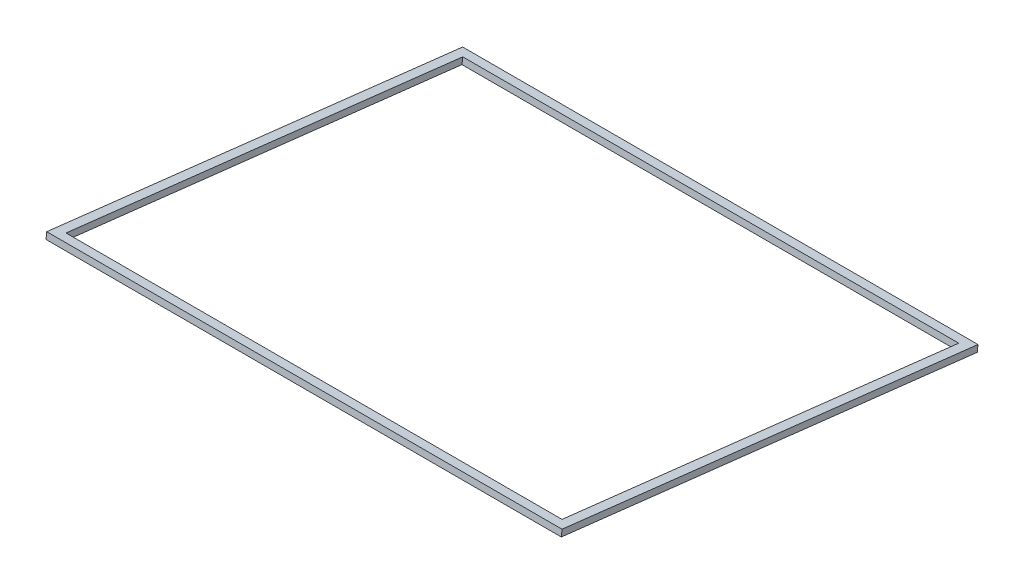
ISO-10303-21;
HEADER;
FILE_DESCRIPTION(('STEP AP214'),'2;1');
FILE_NAME('part.step','',(''),(''),'','','');
FILE_SCHEMA(('AUTOMOTIVE_DESIGN { 1 0 10303 214 1 1 1 1 }'));
ENDSEC;
DATA;
#1=APPLICATION_CONTEXT('core data for automotive mechanical design processes');
#2=APPLICATION_PROTOCOL_DEFINITION('international standard','automotive_design',2000,#1);
#3=PRODUCT_CONTEXT('',#1,'mechanical');
#4=PRODUCT('Part','Part','',(#3));
#5=PRODUCT_RELATED_PRODUCT_CATEGORY('part','',(#4));
#6=PRODUCT_DEFINITION_FORMATION('','',#4);
#7=PRODUCT_DEFINITION_CONTEXT('part definition',#1,'design');
#8=PRODUCT_DEFINITION('design','',#6,#7);
#9=PRODUCT_DEFINITION_SHAPE('','',#8);
#10=(LENGTH_UNIT() NAMED_UNIT(*) SI_UNIT(.MILLI.,.METRE.));
#11=(NAMED_UNIT(*) PLANE_ANGLE_UNIT() SI_UNIT($,.RADIAN.));
#12=(NAMED_UNIT(*) SI_UNIT($,.STERADIAN.) SOLID_ANGLE_UNIT());
#13=UNCERTAINTY_MEASURE_WITH_UNIT(LENGTH_MEASURE(1.E-05),#10,'distance_accuracy_value','');
#14=(GEOMETRIC_REPRESENTATION_CONTEXT(3) GLOBAL_UNCERTAINTY_ASSIGNED_CONTEXT((#13)) GLOBAL_UNIT_ASSIGNED_CONTEXT((#10,
#11,#12)) REPRESENTATION_CONTEXT('',''));
#15=CARTESIAN_POINT('',(0.,0.,0.));
#16=DIRECTION('',(0.,0.,1.));
#17=DIRECTION('',(1.,0.,0.));
#18=AXIS2_PLACEMENT_3D('',#15,#16,#17);
#19=CARTESIAN_POINT('',(-214.99999999998,449.434853441623,-268.547807359262));
#20=DIRECTION('',(-1.,0.,0.));
#21=DIRECTION('',(0.,-1.,0.));
#22=AXIS2_PLACEMENT_3D('',#19,#20,#21);
#23=PLANE('',#22);
#24=DIRECTION('',(0.,0.114660273656609,0.993404762241953));
#25=VECTOR('',#24,1.);
#26=CARTESIAN_POINT('',(-214.99999999998,451.421662966107,-268.777127906575));
#27=LINE('',#26,#25);
#28=CARTESIAN_POINT('',(-214.99999999998,451.421662966107,-268.777127906575));
#29=VERTEX_POINT('',#28);
#30=CARTESIAN_POINT('',(-214.99999999998,466.327498541466,-139.634508815121));
#31=VERTEX_POINT('',#30);
#32=EDGE_CURVE('E135',#29,#31,#27,.T.);
#33=ORIENTED_EDGE('',*,*,#32,.F.);
#34=DIRECTION('',(0.,0.993404762241953,-0.114660273656608));
#35=VECTOR('',#34,1.);
#36=CARTESIAN_POINT('',(-214.99999999998,449.434853441623,-268.547807359262));
#37=LINE('',#36,#35);
#38=CARTESIAN_POINT('',(-214.99999999998,449.434853441623,-268.547807359262));
#39=VERTEX_POINT('',#38);
#40=EDGE_CURVE('E11',#39,#29,#37,.T.);
#41=ORIENTED_EDGE('',*,*,#40,.F.);
#42=DIRECTION('',(0.,0.114660273656609,0.993404762241953));
#43=VECTOR('',#42,1.);
#44=CARTESIAN_POINT('',(-214.99999999998,449.434853441623,-268.547807359262));
#45=LINE('',#44,#43);
#46=CARTESIAN_POINT('',(-214.99999999998,464.340689016982,-139.405188267808));
#47=VERTEX_POINT('',#46);
#48=EDGE_CURVE('E139',#39,#47,#45,.T.);
#49=ORIENTED_EDGE('',*,*,#48,.T.);
#50=DIRECTION('',(0.,0.993404762241953,-0.114660273656608));
#51=VECTOR('',#50,1.);
#52=CARTESIAN_POINT('',(-214.99999999998,464.340689016982,-139.405188267808));
#53=LINE('',#52,#51);
#54=EDGE_CURVE('E40',#47,#31,#53,.T.);
#55=ORIENTED_EDGE('',*,*,#54,.T.);
#56=EDGE_LOOP('',(#33,#41,#49,#55));
#57=FACE_BOUND('',#56,.T.);
#58=ADVANCED_FACE('F37',(#57),#23,.T.);
#59=CARTESIAN_POINT('',(-54.9999999999791,449.434853441624,-268.547807359262));
#60=DIRECTION('',(0.,-0.114660273656608,-0.993404762241953));
#61=DIRECTION('',(0.,0.993404762241953,-0.114660273656608));
#62=AXIS2_PLACEMENT_3D('',#59,#60,#61);
#63=PLANE('',#62);
#64=DIRECTION('',(-1.,0.,0.));
#65=VECTOR('',#64,1.);
#66=CARTESIAN_POINT('',(-54.9999999999791,451.421662966108,-268.777127906575));
#67=LINE('',#66,#65);
#68=CARTESIAN_POINT('',(-54.9999999999791,451.421662966108,-268.777127906575));
#69=VERTEX_POINT('',#68);
#70=EDGE_CURVE('E143',#69,#29,#67,.T.);
#71=ORIENTED_EDGE('',*,*,#70,.F.);
#72=DIRECTION('',(0.,0.993404762241953,-0.114660273656608));
#73=VECTOR('',#72,1.);
#74=CARTESIAN_POINT('',(-54.9999999999791,449.434853441624,-268.547807359262));
#75=LINE('',#74,#73);
#76=CARTESIAN_POINT('',(-54.9999999999791,449.434853441624,-268.547807359262));
#77=VERTEX_POINT('',#76);
#78=EDGE_CURVE('E45',#77,#69,#75,.T.);
#79=ORIENTED_EDGE('',*,*,#78,.F.);
#80=DIRECTION('',(-1.,0.,0.));
#81=VECTOR('',#80,1.);
#82=CARTESIAN_POINT('',(-54.9999999999791,449.434853441624,-268.547807359262));
#83=LINE('',#82,#81);
#84=EDGE_CURVE('E149',#77,#39,#83,.T.);
#85=ORIENTED_EDGE('',*,*,#84,.T.);
#86=ORIENTED_EDGE('',*,*,#40,.T.);
#87=EDGE_LOOP('',(#71,#79,#85,#86));
#88=FACE_BOUND('',#87,.T.);
#89=ADVANCED_FACE('F175',(#88),#63,.T.);
#90=CARTESIAN_POINT('',(-54.9999999999791,464.340689016984,-139.405188267808));
#91=DIRECTION('',(1.,0.,0.));
#92=DIRECTION('',(0.,1.,0.));
#93=AXIS2_PLACEMENT_3D('',#90,#91,#92);
#94=PLANE('',#93);
#95=DIRECTION('',(0.,-0.114660273656608,-0.993404762241953));
#96=VECTOR('',#95,1.);
#97=CARTESIAN_POINT('',(-54.9999999999791,466.327498541467,-139.634508815121));
#98=LINE('',#97,#96);
#99=CARTESIAN_POINT('',(-54.9999999999791,466.327498541467,-139.634508815121));
#100=VERTEX_POINT('',#99);
#101=EDGE_CURVE('E157',#100,#69,#98,.T.);
#102=ORIENTED_EDGE('',*,*,#101,.F.);
#103=DIRECTION('',(0.,0.993404762241953,-0.114660273656608));
#104=VECTOR('',#103,1.);
#105=CARTESIAN_POINT('',(-54.9999999999791,464.340689016984,-139.405188267808));
#106=LINE('',#105,#104);
#107=CARTESIAN_POINT('',(-54.9999999999791,464.340689016984,-139.405188267808));
#108=VERTEX_POINT('',#107);
#109=EDGE_CURVE('E162',#108,#100,#106,.T.);
#110=ORIENTED_EDGE('',*,*,#109,.F.);
#111=DIRECTION('',(0.,-0.114660273656608,-0.993404762241953));
#112=VECTOR('',#111,1.);
#113=CARTESIAN_POINT('',(-54.9999999999791,464.340689016984,-139.405188267808));
#114=LINE('',#113,#112);
#115=EDGE_CURVE('E146',#108,#77,#114,.T.);
#116=ORIENTED_EDGE('',*,*,#115,.T.);
#117=ORIENTED_EDGE('',*,*,#78,.T.);
#118=EDGE_LOOP('',(#102,#110,#116,#117));
#119=FACE_BOUND('',#118,.T.);
#120=ADVANCED_FACE('F179',(#119),#94,.T.);
#121=CARTESIAN_POINT('',(-214.99999999998,464.340689016982,-139.405188267808));
#122=DIRECTION('',(0.,0.114660273656608,0.993404762241953));
#123=DIRECTION('',(0.,-0.993404762241953,0.114660273656608));
#124=AXIS2_PLACEMENT_3D('',#121,#122,#123);
#125=PLANE('',#124);
#126=DIRECTION('',(1.,0.,0.));
#127=VECTOR('',#126,1.);
#128=CARTESIAN_POINT('',(-214.99999999998,466.327498541466,-139.634508815121));
#129=LINE('',#128,#127);
#130=EDGE_CURVE('E154',#31,#100,#129,.T.);
#131=ORIENTED_EDGE('',*,*,#130,.F.);
#132=ORIENTED_EDGE('',*,*,#54,.F.);
#133=DIRECTION('',(1.,0.,0.));
#134=VECTOR('',#133,1.);
#135=CARTESIAN_POINT('',(-214.99999999998,464.340689016982,-139.405188267808));
#136=LINE('',#135,#134);
#137=EDGE_CURVE('E142',#47,#108,#136,.T.);
#138=ORIENTED_EDGE('',*,*,#137,.T.);
#139=ORIENTED_EDGE('',*,*,#109,.T.);
#140=EDGE_LOOP('',(#131,#132,#138,#139));
#141=FACE_BOUND('',#140,.T.);
#142=ADVANCED_FACE('F170',(#141),#125,.T.);
#143=CARTESIAN_POINT('',(-3.19288301413542E-12,474.114829221433,-54.7230475727731));
#144=DIRECTION('',(0.,0.993404762241953,-0.114660273656609));
#145=DIRECTION('',(0.,0.114660273656609,0.993404762241953));
#146=AXIS2_PLACEMENT_3D('',#143,#144,#145);
#147=PLANE('',#146);
#148=DIRECTION('',(-1.,0.,0.));
#149=VECTOR('',#148,1.);
#150=CARTESIAN_POINT('',(-57.9999999999791,449.778834262594,-265.567593072536));
#151=LINE('',#150,#149);
#152=CARTESIAN_POINT('',(-57.9999999999791,449.778834262594,-265.567593072536));
#153=VERTEX_POINT('',#152);
#154=CARTESIAN_POINT('',(-211.99999999998,449.778834262593,-265.567593072536));
#155=VERTEX_POINT('',#154);
#156=EDGE_CURVE('E110',#153,#155,#151,.T.);
#157=ORIENTED_EDGE('',*,*,#156,.T.);
#158=DIRECTION('',(0.,0.114660273656608,0.993404762241953));
#159=VECTOR('',#158,1.);
#160=CARTESIAN_POINT('',(-211.99999999998,449.778834262593,-265.567593072536));
#161=LINE('',#160,#159);
#162=CARTESIAN_POINT('',(-211.99999999998,463.996708196013,-142.385402554534));
#163=VERTEX_POINT('',#162);
#164=EDGE_CURVE('E104',#155,#163,#161,.T.);
#165=ORIENTED_EDGE('',*,*,#164,.T.);
#166=DIRECTION('',(1.,0.,0.));
#167=VECTOR('',#166,1.);
#168=CARTESIAN_POINT('',(-211.99999999998,463.996708196013,-142.385402554534));
#169=LINE('',#168,#167);
#170=CARTESIAN_POINT('',(-57.9999999999791,463.996708196014,-142.385402554534));
#171=VERTEX_POINT('',#170);
#172=EDGE_CURVE('E113',#163,#171,#169,.T.);
#173=ORIENTED_EDGE('',*,*,#172,.T.);
#174=DIRECTION('',(0.,-0.114660273656608,-0.993404762241953));
#175=VECTOR('',#174,1.);
#176=CARTESIAN_POINT('',(-57.9999999999791,463.996708196014,-142.385402554534));
#177=LINE('',#176,#175);
#178=EDGE_CURVE('E53',#171,#153,#177,.T.);
#179=ORIENTED_EDGE('',*,*,#178,.T.);
#180=EDGE_LOOP('',(#157,#165,#173,#179));
#181=FACE_BOUND('',#180,.T.);
#182=ORIENTED_EDGE('',*,*,#48,.F.);
#183=ORIENTED_EDGE('',*,*,#84,.F.);
#184=ORIENTED_EDGE('',*,*,#115,.F.);
#185=ORIENTED_EDGE('',*,*,#137,.F.);
#186=EDGE_LOOP('',(#182,#183,#184,#185));
#187=FACE_BOUND('',#186,.T.);
#188=ADVANCED_FACE('F117',(#181,#187),#147,.F.);
#189=CARTESIAN_POINT('',(-3.20655786603585E-12,476.101638745917,-54.9523681200863));
#190=DIRECTION('',(0.,0.993404762241953,-0.114660273656609));
#191=DIRECTION('',(0.,0.114660273656609,0.993404762241953));
#192=AXIS2_PLACEMENT_3D('',#189,#190,#191);
#193=PLANE('',#192);
#194=DIRECTION('',(0.,0.114660273656608,0.993404762241953));
#195=VECTOR('',#194,1.);
#196=CARTESIAN_POINT('',(-211.99999999998,451.765643787077,-265.796913619849));
#197=LINE('',#196,#195);
#198=CARTESIAN_POINT('',(-211.99999999998,451.765643787077,-265.796913619849));
#199=VERTEX_POINT('',#198);
#200=CARTESIAN_POINT('',(-211.99999999998,465.983517720497,-142.614723101847));
#201=VERTEX_POINT('',#200);
#202=EDGE_CURVE('E61',#199,#201,#197,.T.);
#203=ORIENTED_EDGE('',*,*,#202,.F.);
#204=DIRECTION('',(-1.,0.,0.));
#205=VECTOR('',#204,1.);
#206=CARTESIAN_POINT('',(-57.9999999999791,451.765643787078,-265.79691361985));
#207=LINE('',#206,#205);
#208=CARTESIAN_POINT('',(-57.9999999999791,451.765643787078,-265.79691361985));
#209=VERTEX_POINT('',#208);
#210=EDGE_CURVE('E120',#209,#199,#207,.T.);
#211=ORIENTED_EDGE('',*,*,#210,.F.);
#212=DIRECTION('',(0.,-0.114660273656608,-0.993404762241953));
#213=VECTOR('',#212,1.);
#214=CARTESIAN_POINT('',(-57.9999999999791,465.983517720498,-142.614723101847));
#215=LINE('',#214,#213);
#216=CARTESIAN_POINT('',(-57.9999999999791,465.983517720498,-142.614723101847));
#217=VERTEX_POINT('',#216);
#218=EDGE_CURVE('E123',#217,#209,#215,.T.);
#219=ORIENTED_EDGE('',*,*,#218,.F.);
#220=DIRECTION('',(1.,0.,0.));
#221=VECTOR('',#220,1.);
#222=CARTESIAN_POINT('',(-211.99999999998,465.983517720497,-142.614723101847));
#223=LINE('',#222,#221);
#224=EDGE_CURVE('E129',#201,#217,#223,.T.);
#225=ORIENTED_EDGE('',*,*,#224,.F.);
#226=EDGE_LOOP('',(#203,#211,#219,#225));
#227=FACE_BOUND('',#226,.T.);
#228=ORIENTED_EDGE('',*,*,#32,.T.);
#229=ORIENTED_EDGE('',*,*,#130,.T.);
#230=ORIENTED_EDGE('',*,*,#101,.T.);
#231=ORIENTED_EDGE('',*,*,#70,.T.);
#232=EDGE_LOOP('',(#228,#229,#230,#231));
#233=FACE_BOUND('',#232,.T.);
#234=ADVANCED_FACE('F172',(#227,#233),#193,.T.);
#235=CARTESIAN_POINT('',(-211.99999999998,449.778834262593,-265.567593072536));
#236=DIRECTION('',(-1.,0.,0.));
#237=DIRECTION('',(0.,-1.,0.));
#238=AXIS2_PLACEMENT_3D('',#235,#236,#237);
#239=PLANE('',#238);
#240=ORIENTED_EDGE('',*,*,#202,.T.);
#241=DIRECTION('',(0.,0.993404762241953,-0.114660273656608));
#242=VECTOR('',#241,1.);
#243=CARTESIAN_POINT('',(-211.99999999998,463.996708196013,-142.385402554534));
#244=LINE('',#243,#242);
#245=EDGE_CURVE('E100',#163,#201,#244,.T.);
#246=ORIENTED_EDGE('',*,*,#245,.F.);
#247=ORIENTED_EDGE('',*,*,#164,.F.);
#248=DIRECTION('',(0.,0.993404762241953,-0.114660273656608));
#249=VECTOR('',#248,1.);
#250=CARTESIAN_POINT('',(-211.99999999998,449.778834262593,-265.567593072536));
#251=LINE('',#250,#249);
#252=EDGE_CURVE('E133',#155,#199,#251,.T.);
#253=ORIENTED_EDGE('',*,*,#252,.T.);
#254=EDGE_LOOP('',(#240,#246,#247,#253));
#255=FACE_BOUND('',#254,.T.);
#256=ADVANCED_FACE('F102',(#255),#239,.F.);
#257=CARTESIAN_POINT('',(-57.9999999999791,449.778834262594,-265.567593072536));
#258=DIRECTION('',(0.,-0.114660273656608,-0.993404762241953));
#259=DIRECTION('',(0.,0.993404762241953,-0.114660273656608));
#260=AXIS2_PLACEMENT_3D('',#257,#258,#259);
#261=PLANE('',#260);
#262=ORIENTED_EDGE('',*,*,#210,.T.);
#263=ORIENTED_EDGE('',*,*,#252,.F.);
#264=ORIENTED_EDGE('',*,*,#156,.F.);
#265=DIRECTION('',(0.,0.993404762241953,-0.114660273656608));
#266=VECTOR('',#265,1.);
#267=CARTESIAN_POINT('',(-57.9999999999791,449.778834262594,-265.567593072536));
#268=LINE('',#267,#266);
#269=EDGE_CURVE('E136',#153,#209,#268,.T.);
#270=ORIENTED_EDGE('',*,*,#269,.T.);
#271=EDGE_LOOP('',(#262,#263,#264,#270));
#272=FACE_BOUND('',#271,.T.);
#273=ADVANCED_FACE('F235',(#272),#261,.F.);
#274=CARTESIAN_POINT('',(-57.9999999999791,463.996708196014,-142.385402554534));
#275=DIRECTION('',(1.,0.,0.));
#276=DIRECTION('',(0.,1.,0.));
#277=AXIS2_PLACEMENT_3D('',#274,#275,#276);
#278=PLANE('',#277);
#279=ORIENTED_EDGE('',*,*,#218,.T.);
#280=ORIENTED_EDGE('',*,*,#269,.F.);
#281=ORIENTED_EDGE('',*,*,#178,.F.);
#282=DIRECTION('',(0.,0.993404762241953,-0.114660273656608));
#283=VECTOR('',#282,1.);
#284=CARTESIAN_POINT('',(-57.9999999999791,463.996708196014,-142.385402554534));
#285=LINE('',#284,#283);
#286=EDGE_CURVE('E109',#171,#217,#285,.T.);
#287=ORIENTED_EDGE('',*,*,#286,.T.);
#288=EDGE_LOOP('',(#279,#280,#281,#287));
#289=FACE_BOUND('',#288,.T.);
#290=ADVANCED_FACE('F245',(#289),#278,.F.);
#291=CARTESIAN_POINT('',(-211.99999999998,463.996708196013,-142.385402554534));
#292=DIRECTION('',(0.,0.114660273656608,0.993404762241953));
#293=DIRECTION('',(0.,-0.993404762241953,0.114660273656608));
#294=AXIS2_PLACEMENT_3D('',#291,#292,#293);
#295=PLANE('',#294);
#296=ORIENTED_EDGE('',*,*,#224,.T.);
#297=ORIENTED_EDGE('',*,*,#286,.F.);
#298=ORIENTED_EDGE('',*,*,#172,.F.);
#299=ORIENTED_EDGE('',*,*,#245,.T.);
#300=EDGE_LOOP('',(#296,#297,#298,#299));
#301=FACE_BOUND('',#300,.T.);
#302=ADVANCED_FACE('F114',(#301),#295,.F.);
#303=CLOSED_SHELL('',(#58,#89,#120,#142,#188,#234,#256,#273,#290,#302));
#304=MANIFOLD_SOLID_BREP('B2',#303);
#305=ADVANCED_BREP_SHAPE_REPRESENTATION('',(#18,#304),#14);
#306=SHAPE_DEFINITION_REPRESENTATION(#9,#305);
ENDSEC;
END-ISO-10303-21;
